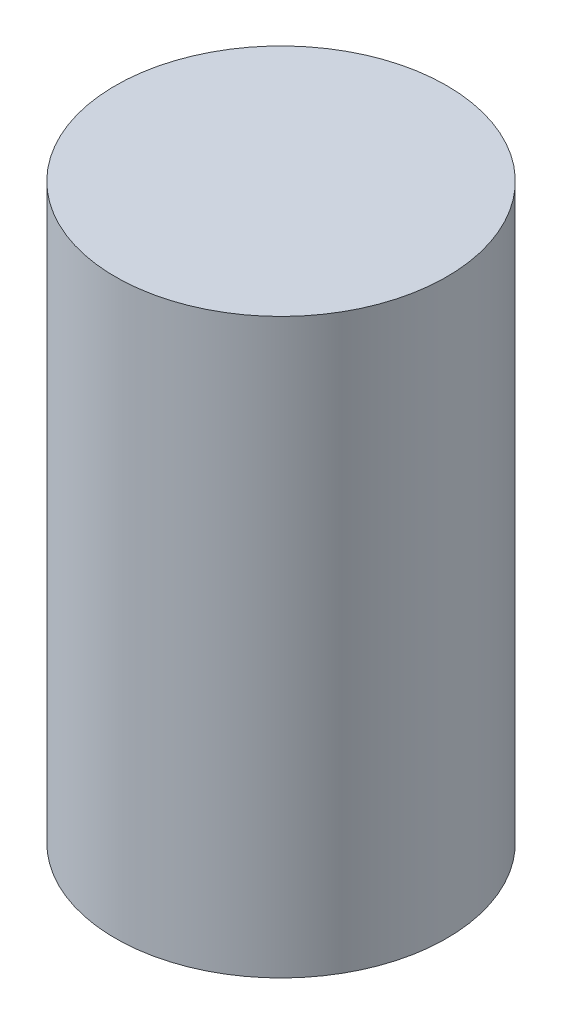
ISO-10303-21;
HEADER;
FILE_DESCRIPTION(('STEP AP214'),'2;1');
FILE_NAME('part.step','',(''),(''),'','','');
FILE_SCHEMA(('AUTOMOTIVE_DESIGN { 1 0 10303 214 1 1 1 1 }'));
ENDSEC;
DATA;
#1=APPLICATION_CONTEXT('core data for automotive mechanical design processes');
#2=APPLICATION_PROTOCOL_DEFINITION('international standard','automotive_design',2000,#1);
#3=PRODUCT_CONTEXT('',#1,'mechanical');
#4=PRODUCT('Part','Part','',(#3));
#5=PRODUCT_RELATED_PRODUCT_CATEGORY('part','',(#4));
#6=PRODUCT_DEFINITION_FORMATION('','',#4);
#7=PRODUCT_DEFINITION_CONTEXT('part definition',#1,'design');
#8=PRODUCT_DEFINITION('design','',#6,#7);
#9=PRODUCT_DEFINITION_SHAPE('','',#8);
#10=(LENGTH_UNIT() NAMED_UNIT(*) SI_UNIT(.MILLI.,.METRE.));
#11=(NAMED_UNIT(*) PLANE_ANGLE_UNIT() SI_UNIT($,.RADIAN.));
#12=(NAMED_UNIT(*) SI_UNIT($,.STERADIAN.) SOLID_ANGLE_UNIT());
#13=UNCERTAINTY_MEASURE_WITH_UNIT(LENGTH_MEASURE(1.E-05),#10,'distance_accuracy_value','');
#14=(GEOMETRIC_REPRESENTATION_CONTEXT(3) GLOBAL_UNCERTAINTY_ASSIGNED_CONTEXT((#13)) GLOBAL_UNIT_ASSIGNED_CONTEXT((#10,
#11,#12)) REPRESENTATION_CONTEXT('',''));
#15=CARTESIAN_POINT('',(0.,0.,0.));
#16=DIRECTION('',(0.,0.,1.));
#17=DIRECTION('',(1.,0.,0.));
#18=AXIS2_PLACEMENT_3D('',#15,#16,#17);
#19=CARTESIAN_POINT('',(0.,16.6,0.));
#20=DIRECTION('',(0.,-1.,0.));
#21=DIRECTION('',(0.,0.,-1.));
#22=AXIS2_PLACEMENT_3D('',#19,#20,#21);
#23=CYLINDRICAL_SURFACE('',#22,4.8);
#24=CARTESIAN_POINT('',(0.,16.6,0.));
#25=DIRECTION('',(0.,1.,0.));
#26=DIRECTION('',(0.,0.,1.));
#27=AXIS2_PLACEMENT_3D('',#24,#25,#26);
#28=CIRCLE('',#27,4.8);
#29=CARTESIAN_POINT('',(0.,16.6,-4.8));
#30=VERTEX_POINT('',#29);
#31=EDGE_CURVE('E10',#30,#30,#28,.T.);
#32=CARTESIAN_POINT('',(0.,0.,0.));
#33=DIRECTION('',(0.,1.,0.));
#34=DIRECTION('',(0.,0.,1.));
#35=AXIS2_PLACEMENT_3D('',#32,#33,#34);
#36=CIRCLE('',#35,4.8);
#37=CARTESIAN_POINT('',(0.,0.,-4.8));
#38=VERTEX_POINT('',#37);
#39=EDGE_CURVE('E44',#38,#38,#36,.T.);
#40=CARTESIAN_POINT('',(0.,16.6,-4.8));
#41=CARTESIAN_POINT('',(0.,16.4270833333333,-4.8));
#42=CARTESIAN_POINT('',(0.,16.2541666666667,-4.8));
#43=CARTESIAN_POINT('',(0.,15.9083333333333,-4.8));
#44=CARTESIAN_POINT('',(0.,15.7354166666667,-4.8));
#45=CARTESIAN_POINT('',(0.,15.3895833333333,-4.8));
#46=CARTESIAN_POINT('',(0.,15.2166666666667,-4.8));
#47=CARTESIAN_POINT('',(0.,14.8708333333333,-4.8));
#48=CARTESIAN_POINT('',(0.,14.6979166666667,-4.8));
#49=CARTESIAN_POINT('',(0.,14.3520833333333,-4.8));
#50=CARTESIAN_POINT('',(0.,14.1791666666667,-4.8));
#51=CARTESIAN_POINT('',(0.,13.8333333333333,-4.8));
#52=CARTESIAN_POINT('',(0.,13.6604166666667,-4.8));
#53=CARTESIAN_POINT('',(0.,13.3145833333333,-4.8));
#54=CARTESIAN_POINT('',(0.,13.1416666666667,-4.8));
#55=CARTESIAN_POINT('',(0.,12.7958333333333,-4.8));
#56=CARTESIAN_POINT('',(0.,12.6229166666667,-4.8));
#57=CARTESIAN_POINT('',(0.,12.2770833333333,-4.8));
#58=CARTESIAN_POINT('',(0.,12.1041666666667,-4.8));
#59=CARTESIAN_POINT('',(0.,11.7583333333333,-4.8));
#60=CARTESIAN_POINT('',(0.,11.5854166666667,-4.8));
#61=CARTESIAN_POINT('',(0.,11.2395833333333,-4.8));
#62=CARTESIAN_POINT('',(0.,11.0666666666667,-4.8));
#63=CARTESIAN_POINT('',(0.,10.7208333333333,-4.8));
#64=CARTESIAN_POINT('',(0.,10.5479166666667,-4.8));
#65=CARTESIAN_POINT('',(0.,10.2020833333333,-4.8));
#66=CARTESIAN_POINT('',(0.,10.0291666666667,-4.8));
#67=CARTESIAN_POINT('',(0.,9.68333333333333,-4.8));
#68=CARTESIAN_POINT('',(0.,9.51041666666667,-4.8));
#69=CARTESIAN_POINT('',(0.,9.16458333333333,-4.8));
#70=CARTESIAN_POINT('',(0.,8.99166666666667,-4.8));
#71=CARTESIAN_POINT('',(0.,8.64583333333333,-4.8));
#72=CARTESIAN_POINT('',(0.,8.47291666666667,-4.8));
#73=CARTESIAN_POINT('',(0.,8.12708333333333,-4.8));
#74=CARTESIAN_POINT('',(0.,7.95416666666667,-4.8));
#75=CARTESIAN_POINT('',(0.,7.60833333333333,-4.8));
#76=CARTESIAN_POINT('',(0.,7.43541666666667,-4.8));
#77=CARTESIAN_POINT('',(0.,7.08958333333333,-4.8));
#78=CARTESIAN_POINT('',(0.,6.91666666666667,-4.8));
#79=CARTESIAN_POINT('',(0.,6.57083333333333,-4.8));
#80=CARTESIAN_POINT('',(0.,6.39791666666667,-4.8));
#81=CARTESIAN_POINT('',(0.,6.05208333333333,-4.8));
#82=CARTESIAN_POINT('',(0.,5.87916666666667,-4.8));
#83=CARTESIAN_POINT('',(0.,5.53333333333333,-4.8));
#84=CARTESIAN_POINT('',(0.,5.36041666666667,-4.8));
#85=CARTESIAN_POINT('',(0.,5.01458333333333,-4.8));
#86=CARTESIAN_POINT('',(0.,4.84166666666667,-4.8));
#87=CARTESIAN_POINT('',(0.,4.49583333333333,-4.8));
#88=CARTESIAN_POINT('',(0.,4.32291666666667,-4.8));
#89=CARTESIAN_POINT('',(0.,3.97708333333333,-4.8));
#90=CARTESIAN_POINT('',(0.,3.80416666666667,-4.8));
#91=CARTESIAN_POINT('',(0.,3.45833333333333,-4.8));
#92=CARTESIAN_POINT('',(0.,3.28541666666667,-4.8));
#93=CARTESIAN_POINT('',(0.,2.93958333333333,-4.8));
#94=CARTESIAN_POINT('',(0.,2.76666666666667,-4.8));
#95=CARTESIAN_POINT('',(0.,2.42083333333333,-4.8));
#96=CARTESIAN_POINT('',(0.,2.24791666666667,-4.8));
#97=CARTESIAN_POINT('',(0.,1.90208333333333,-4.8));
#98=CARTESIAN_POINT('',(0.,1.72916666666667,-4.8));
#99=CARTESIAN_POINT('',(0.,1.38333333333333,-4.8));
#100=CARTESIAN_POINT('',(0.,1.21041666666667,-4.8));
#101=CARTESIAN_POINT('',(0.,0.864583333333333,-4.8));
#102=CARTESIAN_POINT('',(0.,0.691666666666666,-4.8));
#103=CARTESIAN_POINT('',(0.,0.345833333333332,-4.8));
#104=CARTESIAN_POINT('',(0.,0.172916666666666,-4.8));
#105=CARTESIAN_POINT('',(0.,0.,-4.8));
#106=B_SPLINE_CURVE_WITH_KNOTS('',3,(#40,#41,#42,#43,#44,#45,#46,#47,#48,#49,#50,#51,#52,#53,
#54,#55,#56,#57,#58,#59,#60,#61,#62,#63,#64,#65,#66,#67,#68,#69,#70,#71,#72,#73,#74,#75,#76,#77,
#78,#79,#80,#81,#82,#83,#84,#85,#86,#87,#88,#89,#90,#91,#92,#93,#94,#95,#96,#97,#98,#99,#100,
#101,#102,#103,#104,#105),.UNSPECIFIED.,.F.,.F.,(4,2,2,2,2,2,2,2,2,2,2,2,2,2,2,2,2,2,2,2,2,2,2,
2,2,2,2,2,2,2,2,2,4),(0.,0.518749999999998,1.0375,1.55625,2.075,2.59375,3.1125,3.63125,4.15,
4.66875,5.1875,5.70625,6.225,6.74375,7.2625,7.78125,8.3,8.81875,9.3375,9.85625,10.375,10.89375,
11.4125,11.93125,12.45,12.96875,13.4875,14.00625,14.525,15.04375,15.5625,16.08125,16.6),.UNSPECIFIED.);
#107=EDGE_CURVE('BSEAM41',#30,#38,#106,.T.);
#108=ORIENTED_EDGE('',*,*,#31,.F.);
#109=ORIENTED_EDGE('',*,*,#39,.T.);
#110=ORIENTED_EDGE('',*,*,#107,.T.);
#111=ORIENTED_EDGE('',*,*,#107,.F.);
#112=EDGE_LOOP('',(#108,#110,#109,#111));
#113=FACE_BOUND('',#112,.T.);
#114=ADVANCED_FACE('F41',(#113),#23,.T.);
#115=CARTESIAN_POINT('',(0.,16.6,0.));
#116=DIRECTION('',(0.,1.,0.));
#117=DIRECTION('',(0.,0.,1.));
#118=AXIS2_PLACEMENT_3D('',#115,#116,#117);
#119=PLANE('',#118);
#120=ORIENTED_EDGE('',*,*,#31,.T.);
#121=EDGE_LOOP('',(#120));
#122=FACE_BOUND('',#121,.T.);
#123=ADVANCED_FACE('F58',(#122),#119,.T.);
#124=CARTESIAN_POINT('',(0.,0.,0.));
#125=DIRECTION('',(0.,1.,0.));
#126=DIRECTION('',(0.,0.,1.));
#127=AXIS2_PLACEMENT_3D('',#124,#125,#126);
#128=PLANE('',#127);
#129=ORIENTED_EDGE('',*,*,#39,.F.);
#130=EDGE_LOOP('',(#129));
#131=FACE_BOUND('',#130,.T.);
#132=ADVANCED_FACE('F56',(#131),#128,.F.);
#133=CLOSED_SHELL('',(#114,#123,#132));
#134=MANIFOLD_SOLID_BREP('B2',#133);
#135=ADVANCED_BREP_SHAPE_REPRESENTATION('',(#18,#134),#14);
#136=SHAPE_DEFINITION_REPRESENTATION(#9,#135);
ENDSEC;
END-ISO-10303-21;
